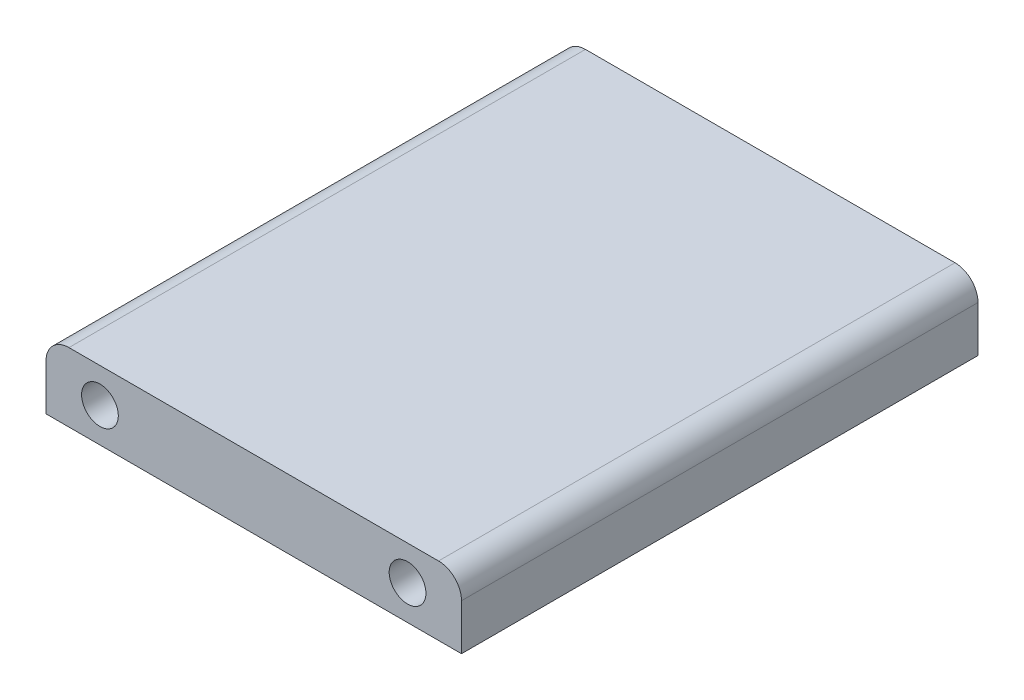
ISO-10303-21;
HEADER;
FILE_DESCRIPTION(('STEP AP214'),'2;1');
FILE_NAME('part.step','',(''),(''),'','','');
FILE_SCHEMA(('AUTOMOTIVE_DESIGN { 1 0 10303 214 1 1 1 1 }'));
ENDSEC;
DATA;
#1=APPLICATION_CONTEXT('core data for automotive mechanical design processes');
#2=APPLICATION_PROTOCOL_DEFINITION('international standard','automotive_design',2000,#1);
#3=PRODUCT_CONTEXT('',#1,'mechanical');
#4=PRODUCT('Part','Part','',(#3));
#5=PRODUCT_RELATED_PRODUCT_CATEGORY('part','',(#4));
#6=PRODUCT_DEFINITION_FORMATION('','',#4);
#7=PRODUCT_DEFINITION_CONTEXT('part definition',#1,'design');
#8=PRODUCT_DEFINITION('design','',#6,#7);
#9=PRODUCT_DEFINITION_SHAPE('','',#8);
#10=(LENGTH_UNIT() NAMED_UNIT(*) SI_UNIT(.MILLI.,.METRE.));
#11=(NAMED_UNIT(*) PLANE_ANGLE_UNIT() SI_UNIT($,.RADIAN.));
#12=(NAMED_UNIT(*) SI_UNIT($,.STERADIAN.) SOLID_ANGLE_UNIT());
#13=UNCERTAINTY_MEASURE_WITH_UNIT(LENGTH_MEASURE(1.E-05),#10,'distance_accuracy_value','');
#14=(GEOMETRIC_REPRESENTATION_CONTEXT(3) GLOBAL_UNCERTAINTY_ASSIGNED_CONTEXT((#13)) GLOBAL_UNIT_ASSIGNED_CONTEXT((#10,
#11,#12)) REPRESENTATION_CONTEXT('',''));
#15=CARTESIAN_POINT('',(0.,0.,0.));
#16=DIRECTION('',(0.,0.,1.));
#17=DIRECTION('',(1.,0.,0.));
#18=AXIS2_PLACEMENT_3D('',#15,#16,#17);
#19=CARTESIAN_POINT('',(18.1,6.,22.5));
#20=DIRECTION('',(-1.,0.,0.));
#21=DIRECTION('',(0.,0.,1.));
#22=AXIS2_PLACEMENT_3D('',#19,#20,#21);
#23=PLANE('',#22);
#24=DIRECTION('',(0.,-1.,0.));
#25=VECTOR('',#24,1.);
#26=CARTESIAN_POINT('',(18.1,6.,-22.5));
#27=LINE('',#26,#25);
#28=CARTESIAN_POINT('',(18.1,4.,-22.5));
#29=VERTEX_POINT('',#28);
#30=CARTESIAN_POINT('',(18.1,0.,-22.5));
#31=VERTEX_POINT('',#30);
#32=EDGE_CURVE('E89',#29,#31,#27,.T.);
#33=ORIENTED_EDGE('',*,*,#32,.F.);
#34=DIRECTION('',(0.,0.,-1.));
#35=VECTOR('',#34,1.);
#36=CARTESIAN_POINT('',(18.1,4.,22.5));
#37=LINE('',#36,#35);
#38=CARTESIAN_POINT('',(18.1,4.,22.5));
#39=VERTEX_POINT('',#38);
#40=EDGE_CURVE('E60',#29,#39,#37,.F.);
#41=ORIENTED_EDGE('',*,*,#40,.T.);
#42=DIRECTION('',(0.,-1.,0.));
#43=VECTOR('',#42,1.);
#44=CARTESIAN_POINT('',(18.1,6.,22.5));
#45=LINE('',#44,#43);
#46=CARTESIAN_POINT('',(18.1,0.,22.5));
#47=VERTEX_POINT('',#46);
#48=EDGE_CURVE('E109',#39,#47,#45,.T.);
#49=ORIENTED_EDGE('',*,*,#48,.T.);
#50=DIRECTION('',(0.,0.,-1.));
#51=VECTOR('',#50,1.);
#52=CARTESIAN_POINT('',(18.1,0.,22.5));
#53=LINE('',#52,#51);
#54=EDGE_CURVE('E105',#47,#31,#53,.T.);
#55=ORIENTED_EDGE('',*,*,#54,.T.);
#56=EDGE_LOOP('',(#33,#41,#49,#55));
#57=FACE_BOUND('',#56,.T.);
#58=ADVANCED_FACE('F37',(#57),#23,.F.);
#59=CARTESIAN_POINT('',(-18.1,6.,-22.5));
#60=DIRECTION('',(0.,0.,1.));
#61=DIRECTION('',(1.,0.,0.));
#62=AXIS2_PLACEMENT_3D('',#59,#60,#61);
#63=PLANE('',#62);
#64=CARTESIAN_POINT('',(-13.4,3.,-22.5));
#65=DIRECTION('',(0.,0.,1.));
#66=DIRECTION('',(1.,0.,0.));
#67=AXIS2_PLACEMENT_3D('',#64,#65,#66);
#68=CIRCLE('',#67,1.6);
#69=CARTESIAN_POINT('',(-11.8,3.,-22.5));
#70=VERTEX_POINT('',#69);
#71=EDGE_CURVE('E111',#70,#70,#68,.T.);
#72=ORIENTED_EDGE('',*,*,#71,.T.);
#73=EDGE_LOOP('',(#72));
#74=FACE_BOUND('',#73,.T.);
#75=CARTESIAN_POINT('',(13.4,3.,-22.5));
#76=DIRECTION('',(0.,0.,1.));
#77=DIRECTION('',(-1.,0.,0.));
#78=AXIS2_PLACEMENT_3D('',#75,#76,#77);
#79=CIRCLE('',#78,1.6);
#80=CARTESIAN_POINT('',(15.,3.,-22.5));
#81=VERTEX_POINT('',#80);
#82=EDGE_CURVE('E184',#81,#81,#79,.T.);
#83=ORIENTED_EDGE('',*,*,#82,.T.);
#84=EDGE_LOOP('',(#83));
#85=FACE_BOUND('',#84,.T.);
#86=DIRECTION('',(-1.,0.,0.));
#87=VECTOR('',#86,1.);
#88=CARTESIAN_POINT('',(-18.1,6.,-22.5));
#89=LINE('',#88,#87);
#90=CARTESIAN_POINT('',(16.1,6.,-22.5));
#91=VERTEX_POINT('',#90);
#92=CARTESIAN_POINT('',(-16.1,6.,-22.5));
#93=VERTEX_POINT('',#92);
#94=EDGE_CURVE('E123',#91,#93,#89,.T.);
#95=ORIENTED_EDGE('',*,*,#94,.F.);
#96=CARTESIAN_POINT('',(16.1,4.,-22.5));
#97=DIRECTION('',(0.,0.,1.));
#98=DIRECTION('',(1.,0.,0.));
#99=AXIS2_PLACEMENT_3D('',#96,#97,#98);
#100=CIRCLE('',#99,2.);
#101=EDGE_CURVE('E96',#91,#29,#100,.F.);
#102=ORIENTED_EDGE('',*,*,#101,.T.);
#103=ORIENTED_EDGE('',*,*,#32,.T.);
#104=DIRECTION('',(-1.,0.,0.));
#105=VECTOR('',#104,1.);
#106=CARTESIAN_POINT('',(-18.1,0.,-22.5));
#107=LINE('',#106,#105);
#108=CARTESIAN_POINT('',(-18.1,0.,-22.5));
#109=VERTEX_POINT('',#108);
#110=EDGE_CURVE('E94',#31,#109,#107,.T.);
#111=ORIENTED_EDGE('',*,*,#110,.T.);
#112=DIRECTION('',(0.,-1.,0.));
#113=VECTOR('',#112,1.);
#114=CARTESIAN_POINT('',(-18.1,6.,-22.5));
#115=LINE('',#114,#113);
#116=CARTESIAN_POINT('',(-18.1,4.,-22.5));
#117=VERTEX_POINT('',#116);
#118=EDGE_CURVE('E99',#117,#109,#115,.T.);
#119=ORIENTED_EDGE('',*,*,#118,.F.);
#120=CARTESIAN_POINT('',(-16.1,4.,-22.5));
#121=DIRECTION('',(0.,0.,1.));
#122=DIRECTION('',(1.,0.,0.));
#123=AXIS2_PLACEMENT_3D('',#120,#121,#122);
#124=CIRCLE('',#123,2.);
#125=EDGE_CURVE('E133',#117,#93,#124,.F.);
#126=ORIENTED_EDGE('',*,*,#125,.T.);
#127=EDGE_LOOP('',(#95,#102,#103,#111,#119,#126));
#128=FACE_BOUND('',#127,.T.);
#129=ADVANCED_FACE('F92',(#74,#85,#128),#63,.F.);
#130=CARTESIAN_POINT('',(-18.1,6.,22.5));
#131=DIRECTION('',(1.,0.,0.));
#132=DIRECTION('',(0.,0.,-1.));
#133=AXIS2_PLACEMENT_3D('',#130,#131,#132);
#134=PLANE('',#133);
#135=DIRECTION('',(0.,-1.,0.));
#136=VECTOR('',#135,1.);
#137=CARTESIAN_POINT('',(-18.1,6.,22.5));
#138=LINE('',#137,#136);
#139=CARTESIAN_POINT('',(-18.1,4.,22.5));
#140=VERTEX_POINT('',#139);
#141=CARTESIAN_POINT('',(-18.1,0.,22.5));
#142=VERTEX_POINT('',#141);
#143=EDGE_CURVE('E125',#140,#142,#138,.T.);
#144=ORIENTED_EDGE('',*,*,#143,.F.);
#145=DIRECTION('',(0.,0.,1.));
#146=VECTOR('',#145,1.);
#147=CARTESIAN_POINT('',(-18.1,4.,22.5));
#148=LINE('',#147,#146);
#149=EDGE_CURVE('E11',#140,#117,#148,.F.);
#150=ORIENTED_EDGE('',*,*,#149,.T.);
#151=ORIENTED_EDGE('',*,*,#118,.T.);
#152=DIRECTION('',(0.,0.,1.));
#153=VECTOR('',#152,1.);
#154=CARTESIAN_POINT('',(-18.1,0.,22.5));
#155=LINE('',#154,#153);
#156=EDGE_CURVE('E107',#109,#142,#155,.T.);
#157=ORIENTED_EDGE('',*,*,#156,.T.);
#158=EDGE_LOOP('',(#144,#150,#151,#157));
#159=FACE_BOUND('',#158,.T.);
#160=ADVANCED_FACE('F160',(#159),#134,.F.);
#161=CARTESIAN_POINT('',(-18.1,6.,22.5));
#162=DIRECTION('',(0.,0.,-1.));
#163=DIRECTION('',(-1.,0.,0.));
#164=AXIS2_PLACEMENT_3D('',#161,#162,#163);
#165=PLANE('',#164);
#166=CARTESIAN_POINT('',(-13.4,3.,22.5));
#167=DIRECTION('',(0.,0.,1.));
#168=DIRECTION('',(1.,0.,0.));
#169=AXIS2_PLACEMENT_3D('',#166,#167,#168);
#170=CIRCLE('',#169,1.6);
#171=CARTESIAN_POINT('',(-11.8,3.,22.5));
#172=VERTEX_POINT('',#171);
#173=EDGE_CURVE('E114',#172,#172,#170,.T.);
#174=ORIENTED_EDGE('',*,*,#173,.F.);
#175=EDGE_LOOP('',(#174));
#176=FACE_BOUND('',#175,.T.);
#177=CARTESIAN_POINT('',(13.4,3.,22.5));
#178=DIRECTION('',(0.,0.,1.));
#179=DIRECTION('',(-1.,0.,0.));
#180=AXIS2_PLACEMENT_3D('',#177,#178,#179);
#181=CIRCLE('',#180,1.6);
#182=CARTESIAN_POINT('',(15.,3.,22.5));
#183=VERTEX_POINT('',#182);
#184=EDGE_CURVE('E187',#183,#183,#181,.T.);
#185=ORIENTED_EDGE('',*,*,#184,.F.);
#186=EDGE_LOOP('',(#185));
#187=FACE_BOUND('',#186,.T.);
#188=ORIENTED_EDGE('',*,*,#48,.F.);
#189=CARTESIAN_POINT('',(16.1,4.,22.5));
#190=DIRECTION('',(0.,0.,-1.));
#191=DIRECTION('',(-1.,0.,0.));
#192=AXIS2_PLACEMENT_3D('',#189,#190,#191);
#193=CIRCLE('',#192,2.);
#194=CARTESIAN_POINT('',(16.1,6.,22.5));
#195=VERTEX_POINT('',#194);
#196=EDGE_CURVE('E45',#39,#195,#193,.F.);
#197=ORIENTED_EDGE('',*,*,#196,.T.);
#198=DIRECTION('',(1.,0.,0.));
#199=VECTOR('',#198,1.);
#200=CARTESIAN_POINT('',(-18.1,6.,22.5));
#201=LINE('',#200,#199);
#202=CARTESIAN_POINT('',(-16.1,6.,22.5));
#203=VERTEX_POINT('',#202);
#204=EDGE_CURVE('E117',#203,#195,#201,.T.);
#205=ORIENTED_EDGE('',*,*,#204,.F.);
#206=CARTESIAN_POINT('',(-16.1,4.,22.5));
#207=DIRECTION('',(0.,0.,-1.));
#208=DIRECTION('',(-1.,0.,0.));
#209=AXIS2_PLACEMENT_3D('',#206,#207,#208);
#210=CIRCLE('',#209,2.);
#211=EDGE_CURVE('E52',#203,#140,#210,.F.);
#212=ORIENTED_EDGE('',*,*,#211,.T.);
#213=ORIENTED_EDGE('',*,*,#143,.T.);
#214=DIRECTION('',(1.,0.,0.));
#215=VECTOR('',#214,1.);
#216=CARTESIAN_POINT('',(-18.1,0.,22.5));
#217=LINE('',#216,#215);
#218=EDGE_CURVE('E121',#142,#47,#217,.T.);
#219=ORIENTED_EDGE('',*,*,#218,.T.);
#220=EDGE_LOOP('',(#188,#197,#205,#212,#213,#219));
#221=FACE_BOUND('',#220,.T.);
#222=ADVANCED_FACE('F139',(#176,#187,#221),#165,.F.);
#223=CARTESIAN_POINT('',(0.,6.,0.));
#224=DIRECTION('',(0.,-1.,0.));
#225=DIRECTION('',(0.,0.,-1.));
#226=AXIS2_PLACEMENT_3D('',#223,#224,#225);
#227=PLANE('',#226);
#228=ORIENTED_EDGE('',*,*,#204,.T.);
#229=DIRECTION('',(0.,0.,-1.));
#230=VECTOR('',#229,1.);
#231=CARTESIAN_POINT('',(16.1,6.,0.));
#232=LINE('',#231,#230);
#233=EDGE_CURVE('E130',#195,#91,#232,.T.);
#234=ORIENTED_EDGE('',*,*,#233,.T.);
#235=ORIENTED_EDGE('',*,*,#94,.T.);
#236=DIRECTION('',(0.,0.,1.));
#237=VECTOR('',#236,1.);
#238=CARTESIAN_POINT('',(-16.1,6.,0.));
#239=LINE('',#238,#237);
#240=EDGE_CURVE('E98',#93,#203,#239,.T.);
#241=ORIENTED_EDGE('',*,*,#240,.T.);
#242=EDGE_LOOP('',(#228,#234,#235,#241));
#243=FACE_BOUND('',#242,.T.);
#244=ADVANCED_FACE('F143',(#243),#227,.F.);
#245=CARTESIAN_POINT('',(0.,0.,0.));
#246=DIRECTION('',(0.,-1.,0.));
#247=DIRECTION('',(0.,0.,-1.));
#248=AXIS2_PLACEMENT_3D('',#245,#246,#247);
#249=PLANE('',#248);
#250=ORIENTED_EDGE('',*,*,#54,.F.);
#251=ORIENTED_EDGE('',*,*,#218,.F.);
#252=ORIENTED_EDGE('',*,*,#156,.F.);
#253=ORIENTED_EDGE('',*,*,#110,.F.);
#254=EDGE_LOOP('',(#250,#251,#252,#253));
#255=FACE_BOUND('',#254,.T.);
#256=ADVANCED_FACE('F103',(#255),#249,.T.);
#257=CARTESIAN_POINT('',(16.1,4.,0.));
#258=DIRECTION('',(0.,0.,-1.));
#259=DIRECTION('',(-1.,0.,0.));
#260=AXIS2_PLACEMENT_3D('',#257,#258,#259);
#261=CYLINDRICAL_SURFACE('',#260,2.);
#262=ORIENTED_EDGE('',*,*,#196,.F.);
#263=ORIENTED_EDGE('',*,*,#40,.F.);
#264=ORIENTED_EDGE('',*,*,#101,.F.);
#265=ORIENTED_EDGE('',*,*,#233,.F.);
#266=EDGE_LOOP('',(#262,#263,#264,#265));
#267=FACE_BOUND('',#266,.T.);
#268=ADVANCED_FACE('F146',(#267),#261,.T.);
#269=CARTESIAN_POINT('',(-16.1,4.,0.));
#270=DIRECTION('',(0.,0.,1.));
#271=DIRECTION('',(1.,0.,0.));
#272=AXIS2_PLACEMENT_3D('',#269,#270,#271);
#273=CYLINDRICAL_SURFACE('',#272,2.);
#274=ORIENTED_EDGE('',*,*,#125,.F.);
#275=ORIENTED_EDGE('',*,*,#149,.F.);
#276=ORIENTED_EDGE('',*,*,#211,.F.);
#277=ORIENTED_EDGE('',*,*,#240,.F.);
#278=EDGE_LOOP('',(#274,#275,#276,#277));
#279=FACE_BOUND('',#278,.T.);
#280=ADVANCED_FACE('F39',(#279),#273,.T.);
#281=CARTESIAN_POINT('',(13.4,3.,-22.5));
#282=DIRECTION('',(0.,0.,1.));
#283=DIRECTION('',(1.,0.,0.));
#284=AXIS2_PLACEMENT_3D('',#281,#282,#283);
#285=CYLINDRICAL_SURFACE('',#284,1.6);
#286=CARTESIAN_POINT('',(15.,3.,-22.5));
#287=CARTESIAN_POINT('',(15.,3.,-22.03125));
#288=CARTESIAN_POINT('',(15.,3.,-21.5625));
#289=CARTESIAN_POINT('',(15.,3.,-20.625));
#290=CARTESIAN_POINT('',(15.,3.,-20.15625));
#291=CARTESIAN_POINT('',(15.,3.,-19.21875));
#292=CARTESIAN_POINT('',(15.,3.,-18.75));
#293=CARTESIAN_POINT('',(15.,3.,-17.8125));
#294=CARTESIAN_POINT('',(15.,3.,-17.34375));
#295=CARTESIAN_POINT('',(15.,3.,-16.40625));
#296=CARTESIAN_POINT('',(15.,3.,-15.9375));
#297=CARTESIAN_POINT('',(15.,3.,-15.));
#298=CARTESIAN_POINT('',(15.,3.,-14.53125));
#299=CARTESIAN_POINT('',(15.,3.,-13.59375));
#300=CARTESIAN_POINT('',(15.,3.,-13.125));
#301=CARTESIAN_POINT('',(15.,3.,-12.1875));
#302=CARTESIAN_POINT('',(15.,3.,-11.71875));
#303=CARTESIAN_POINT('',(15.,3.,-10.78125));
#304=CARTESIAN_POINT('',(15.,3.,-10.3125));
#305=CARTESIAN_POINT('',(15.,3.,-9.375));
#306=CARTESIAN_POINT('',(15.,3.,-8.90625));
#307=CARTESIAN_POINT('',(15.,3.,-7.96875));
#308=CARTESIAN_POINT('',(15.,3.,-7.5));
#309=CARTESIAN_POINT('',(15.,3.,-6.5625));
#310=CARTESIAN_POINT('',(15.,3.,-6.09375));
#311=CARTESIAN_POINT('',(15.,3.,-5.15625));
#312=CARTESIAN_POINT('',(15.,3.,-4.6875));
#313=CARTESIAN_POINT('',(15.,3.,-3.75));
#314=CARTESIAN_POINT('',(15.,3.,-3.28125));
#315=CARTESIAN_POINT('',(15.,3.,-2.34375));
#316=CARTESIAN_POINT('',(15.,3.,-1.875));
#317=CARTESIAN_POINT('',(15.,3.,-0.937500000000004));
#318=CARTESIAN_POINT('',(15.,3.,-0.468750000000004));
#319=CARTESIAN_POINT('',(15.,3.,0.468749999999997));
#320=CARTESIAN_POINT('',(15.,3.,0.937499999999997));
#321=CARTESIAN_POINT('',(15.,3.,1.875));
#322=CARTESIAN_POINT('',(15.,3.,2.34375));
#323=CARTESIAN_POINT('',(15.,3.,3.28125));
#324=CARTESIAN_POINT('',(15.,3.,3.75));
#325=CARTESIAN_POINT('',(15.,3.,4.6875));
#326=CARTESIAN_POINT('',(15.,3.,5.15624999999999));
#327=CARTESIAN_POINT('',(15.,3.,6.09374999999999));
#328=CARTESIAN_POINT('',(15.,3.,6.5625));
#329=CARTESIAN_POINT('',(15.,3.,7.5));
#330=CARTESIAN_POINT('',(15.,3.,7.96875));
#331=CARTESIAN_POINT('',(15.,3.,8.90625));
#332=CARTESIAN_POINT('',(15.,3.,9.37499999999999));
#333=CARTESIAN_POINT('',(15.,3.,10.3125));
#334=CARTESIAN_POINT('',(15.,3.,10.78125));
#335=CARTESIAN_POINT('',(15.,3.,11.71875));
#336=CARTESIAN_POINT('',(15.,3.,12.1875));
#337=CARTESIAN_POINT('',(15.,3.,13.125));
#338=CARTESIAN_POINT('',(15.,3.,13.59375));
#339=CARTESIAN_POINT('',(15.,3.,14.53125));
#340=CARTESIAN_POINT('',(15.,3.,15.));
#341=CARTESIAN_POINT('',(15.,3.,15.9375));
#342=CARTESIAN_POINT('',(15.,3.,16.40625));
#343=CARTESIAN_POINT('',(15.,3.,17.34375));
#344=CARTESIAN_POINT('',(15.,3.,17.8125));
#345=CARTESIAN_POINT('',(15.,3.,18.75));
#346=CARTESIAN_POINT('',(15.,3.,19.21875));
#347=CARTESIAN_POINT('',(15.,3.,20.15625));
#348=CARTESIAN_POINT('',(15.,3.,20.625));
#349=CARTESIAN_POINT('',(15.,3.,21.5625));
#350=CARTESIAN_POINT('',(15.,3.,22.03125));
#351=CARTESIAN_POINT('',(15.,3.,22.5));
#352=B_SPLINE_CURVE_WITH_KNOTS('',3,(#286,#287,#288,#289,#290,#291,#292,#293,#294,#295,#296,
#297,#298,#299,#300,#301,#302,#303,#304,#305,#306,#307,#308,#309,#310,#311,#312,#313,#314,#315,
#316,#317,#318,#319,#320,#321,#322,#323,#324,#325,#326,#327,#328,#329,#330,#331,#332,#333,#334,
#335,#336,#337,#338,#339,#340,#341,#342,#343,#344,#345,#346,#347,#348,#349,#350,#351),
.UNSPECIFIED.,.F.,.F.,(4,2,2,2,2,2,2,2,2,2,2,2,2,2,2,2,2,2,2,2,2,2,2,2,2,2,2,2,2,2,2,2,4),(0.,
1.40625,2.8125,4.21875,5.625,7.03125,8.4375,9.84375,11.25,12.65625,14.0625,15.46875,16.875,
18.28125,19.6875,21.09375,22.5,23.90625,25.3125,26.71875,28.125,29.53125,30.9375,32.34375,33.75,
35.15625,36.5625,37.96875,39.375,40.78125,42.1875,43.59375,45.),.UNSPECIFIED.);
#353=EDGE_CURVE('BSEAM152',#81,#183,#352,.T.);
#354=ORIENTED_EDGE('',*,*,#82,.F.);
#355=ORIENTED_EDGE('',*,*,#184,.T.);
#356=ORIENTED_EDGE('',*,*,#353,.T.);
#357=ORIENTED_EDGE('',*,*,#353,.F.);
#358=EDGE_LOOP('',(#354,#356,#355,#357));
#359=FACE_BOUND('',#358,.T.);
#360=ADVANCED_FACE('F152',(#359),#285,.F.);
#361=CARTESIAN_POINT('',(-13.4,3.,-22.5));
#362=DIRECTION('',(0.,0.,1.));
#363=DIRECTION('',(1.,0.,0.));
#364=AXIS2_PLACEMENT_3D('',#361,#362,#363);
#365=CYLINDRICAL_SURFACE('',#364,1.6);
#366=CARTESIAN_POINT('',(-11.8,3.,-22.5));
#367=CARTESIAN_POINT('',(-11.8,3.,-22.03125));
#368=CARTESIAN_POINT('',(-11.8,3.,-21.5625));
#369=CARTESIAN_POINT('',(-11.8,3.,-20.625));
#370=CARTESIAN_POINT('',(-11.8,3.,-20.15625));
#371=CARTESIAN_POINT('',(-11.8,3.,-19.21875));
#372=CARTESIAN_POINT('',(-11.8,3.,-18.75));
#373=CARTESIAN_POINT('',(-11.8,3.,-17.8125));
#374=CARTESIAN_POINT('',(-11.8,3.,-17.34375));
#375=CARTESIAN_POINT('',(-11.8,3.,-16.40625));
#376=CARTESIAN_POINT('',(-11.8,3.,-15.9375));
#377=CARTESIAN_POINT('',(-11.8,3.,-15.));
#378=CARTESIAN_POINT('',(-11.8,3.,-14.53125));
#379=CARTESIAN_POINT('',(-11.8,3.,-13.59375));
#380=CARTESIAN_POINT('',(-11.8,3.,-13.125));
#381=CARTESIAN_POINT('',(-11.8,3.,-12.1875));
#382=CARTESIAN_POINT('',(-11.8,3.,-11.71875));
#383=CARTESIAN_POINT('',(-11.8,3.,-10.78125));
#384=CARTESIAN_POINT('',(-11.8,3.,-10.3125));
#385=CARTESIAN_POINT('',(-11.8,3.,-9.375));
#386=CARTESIAN_POINT('',(-11.8,3.,-8.90625));
#387=CARTESIAN_POINT('',(-11.8,3.,-7.96875));
#388=CARTESIAN_POINT('',(-11.8,3.,-7.5));
#389=CARTESIAN_POINT('',(-11.8,3.,-6.5625));
#390=CARTESIAN_POINT('',(-11.8,3.,-6.09375));
#391=CARTESIAN_POINT('',(-11.8,3.,-5.15625));
#392=CARTESIAN_POINT('',(-11.8,3.,-4.6875));
#393=CARTESIAN_POINT('',(-11.8,3.,-3.75));
#394=CARTESIAN_POINT('',(-11.8,3.,-3.28125));
#395=CARTESIAN_POINT('',(-11.8,3.,-2.34375));
#396=CARTESIAN_POINT('',(-11.8,3.,-1.875));
#397=CARTESIAN_POINT('',(-11.8,3.,-0.937500000000004));
#398=CARTESIAN_POINT('',(-11.8,3.,-0.468750000000004));
#399=CARTESIAN_POINT('',(-11.8,3.,0.468749999999997));
#400=CARTESIAN_POINT('',(-11.8,3.,0.937499999999997));
#401=CARTESIAN_POINT('',(-11.8,3.,1.875));
#402=CARTESIAN_POINT('',(-11.8,3.,2.34375));
#403=CARTESIAN_POINT('',(-11.8,3.,3.28125));
#404=CARTESIAN_POINT('',(-11.8,3.,3.75));
#405=CARTESIAN_POINT('',(-11.8,3.,4.6875));
#406=CARTESIAN_POINT('',(-11.8,3.,5.15624999999999));
#407=CARTESIAN_POINT('',(-11.8,3.,6.09374999999999));
#408=CARTESIAN_POINT('',(-11.8,3.,6.5625));
#409=CARTESIAN_POINT('',(-11.8,3.,7.5));
#410=CARTESIAN_POINT('',(-11.8,3.,7.96875));
#411=CARTESIAN_POINT('',(-11.8,3.,8.90625));
#412=CARTESIAN_POINT('',(-11.8,3.,9.37499999999999));
#413=CARTESIAN_POINT('',(-11.8,3.,10.3125));
#414=CARTESIAN_POINT('',(-11.8,3.,10.78125));
#415=CARTESIAN_POINT('',(-11.8,3.,11.71875));
#416=CARTESIAN_POINT('',(-11.8,3.,12.1875));
#417=CARTESIAN_POINT('',(-11.8,3.,13.125));
#418=CARTESIAN_POINT('',(-11.8,3.,13.59375));
#419=CARTESIAN_POINT('',(-11.8,3.,14.53125));
#420=CARTESIAN_POINT('',(-11.8,3.,15.));
#421=CARTESIAN_POINT('',(-11.8,3.,15.9375));
#422=CARTESIAN_POINT('',(-11.8,3.,16.40625));
#423=CARTESIAN_POINT('',(-11.8,3.,17.34375));
#424=CARTESIAN_POINT('',(-11.8,3.,17.8125));
#425=CARTESIAN_POINT('',(-11.8,3.,18.75));
#426=CARTESIAN_POINT('',(-11.8,3.,19.21875));
#427=CARTESIAN_POINT('',(-11.8,3.,20.15625));
#428=CARTESIAN_POINT('',(-11.8,3.,20.625));
#429=CARTESIAN_POINT('',(-11.8,3.,21.5625));
#430=CARTESIAN_POINT('',(-11.8,3.,22.03125));
#431=CARTESIAN_POINT('',(-11.8,3.,22.5));
#432=B_SPLINE_CURVE_WITH_KNOTS('',3,(#366,#367,#368,#369,#370,#371,#372,#373,#374,#375,#376,
#377,#378,#379,#380,#381,#382,#383,#384,#385,#386,#387,#388,#389,#390,#391,#392,#393,#394,#395,
#396,#397,#398,#399,#400,#401,#402,#403,#404,#405,#406,#407,#408,#409,#410,#411,#412,#413,#414,
#415,#416,#417,#418,#419,#420,#421,#422,#423,#424,#425,#426,#427,#428,#429,#430,#431),
.UNSPECIFIED.,.F.,.F.,(4,2,2,2,2,2,2,2,2,2,2,2,2,2,2,2,2,2,2,2,2,2,2,2,2,2,2,2,2,2,2,2,4),(0.,
1.40625,2.8125,4.21875,5.625,7.03125,8.4375,9.84375,11.25,12.65625,14.0625,15.46875,16.875,
18.28125,19.6875,21.09375,22.5,23.90625,25.3125,26.71875,28.125,29.53125,30.9375,32.34375,33.75,
35.15625,36.5625,37.96875,39.375,40.78125,42.1875,43.59375,45.),.UNSPECIFIED.);
#433=EDGE_CURVE('BSEAM174',#70,#172,#432,.T.);
#434=ORIENTED_EDGE('',*,*,#71,.F.);
#435=ORIENTED_EDGE('',*,*,#173,.T.);
#436=ORIENTED_EDGE('',*,*,#433,.T.);
#437=ORIENTED_EDGE('',*,*,#433,.F.);
#438=EDGE_LOOP('',(#434,#436,#435,#437));
#439=FACE_BOUND('',#438,.T.);
#440=ADVANCED_FACE('F174',(#439),#365,.F.);
#441=CLOSED_SHELL('',(#58,#129,#160,#222,#244,#256,#268,#280,#360,#440));
#442=MANIFOLD_SOLID_BREP('B2',#441);
#443=ADVANCED_BREP_SHAPE_REPRESENTATION('',(#18,#442),#14);
#444=SHAPE_DEFINITION_REPRESENTATION(#9,#443);
ENDSEC;
END-ISO-10303-21;
